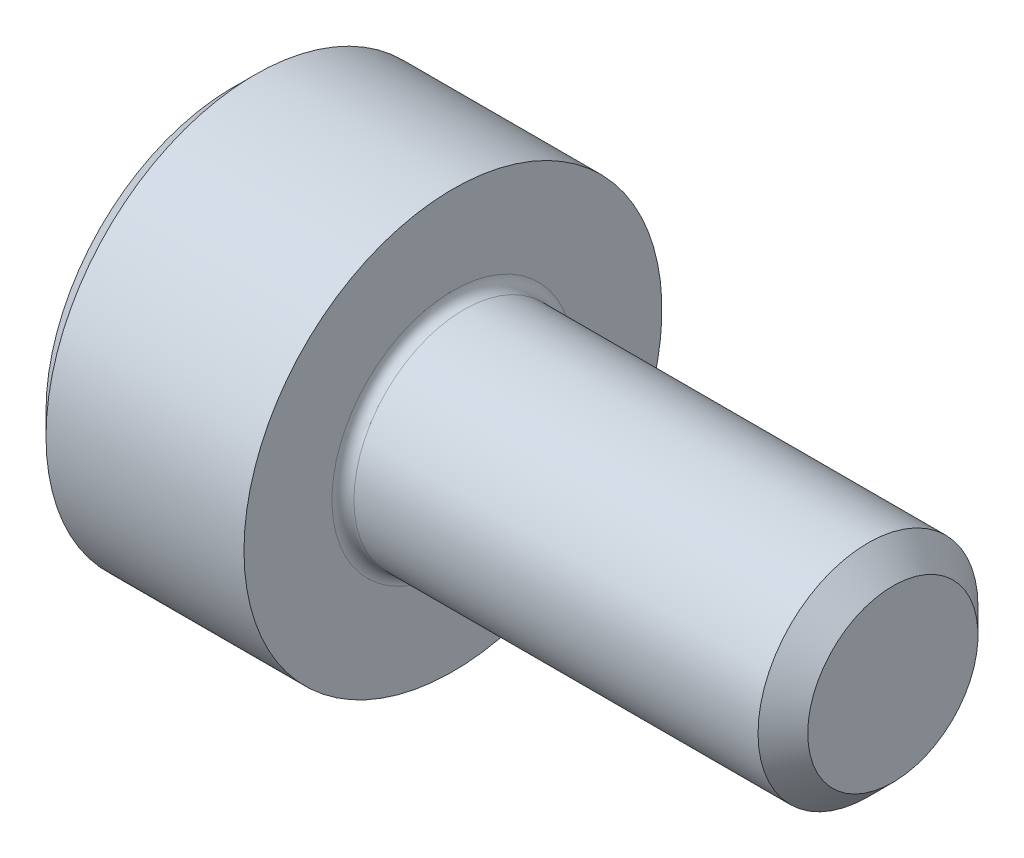
ISO-10303-21;
HEADER;
FILE_DESCRIPTION(('STEP AP214'),'2;1');
FILE_NAME('part.step','',(''),(''),'','','');
FILE_SCHEMA(('AUTOMOTIVE_DESIGN { 1 0 10303 214 1 1 1 1 }'));
ENDSEC;
DATA;
#1=APPLICATION_CONTEXT('core data for automotive mechanical design processes');
#2=APPLICATION_PROTOCOL_DEFINITION('international standard','automotive_design',2000,#1);
#3=PRODUCT_CONTEXT('',#1,'mechanical');
#4=PRODUCT('Part','Part','',(#3));
#5=PRODUCT_RELATED_PRODUCT_CATEGORY('part','',(#4));
#6=PRODUCT_DEFINITION_FORMATION('','',#4);
#7=PRODUCT_DEFINITION_CONTEXT('part definition',#1,'design');
#8=PRODUCT_DEFINITION('design','',#6,#7);
#9=PRODUCT_DEFINITION_SHAPE('','',#8);
#10=(LENGTH_UNIT() NAMED_UNIT(*) SI_UNIT(.MILLI.,.METRE.));
#11=(NAMED_UNIT(*) PLANE_ANGLE_UNIT() SI_UNIT($,.RADIAN.));
#12=(NAMED_UNIT(*) SI_UNIT($,.STERADIAN.) SOLID_ANGLE_UNIT());
#13=UNCERTAINTY_MEASURE_WITH_UNIT(LENGTH_MEASURE(1.E-05),#10,'distance_accuracy_value','');
#14=(GEOMETRIC_REPRESENTATION_CONTEXT(3) GLOBAL_UNCERTAINTY_ASSIGNED_CONTEXT((#13)) GLOBAL_UNIT_ASSIGNED_CONTEXT((#10,
#11,#12)) REPRESENTATION_CONTEXT('',''));
#15=CARTESIAN_POINT('',(0.,0.,0.));
#16=DIRECTION('',(0.,0.,1.));
#17=DIRECTION('',(1.,0.,0.));
#18=AXIS2_PLACEMENT_3D('',#15,#16,#17);
#19=CARTESIAN_POINT('',(0.,0.,0.));
#20=DIRECTION('',(-1.,0.,0.));
#21=DIRECTION('',(0.,0.,1.));
#22=AXIS2_PLACEMENT_3D('',#19,#20,#21);
#23=PLANE('',#22);
#24=DIRECTION('',(0.,-0.499999999999999,0.866025403784439));
#25=VECTOR('',#24,1.);
#26=CARTESIAN_POINT('',(0.,0.892006165897969,0.));
#27=LINE('',#26,#25);
#28=CARTESIAN_POINT('',(0.,0.892006165897969,0.));
#29=VERTEX_POINT('',#28);
#30=CARTESIAN_POINT('',(0.,0.446003082948983,0.772499999999997));
#31=VERTEX_POINT('',#30);
#32=EDGE_CURVE('E390',#29,#31,#27,.T.);
#33=ORIENTED_EDGE('',*,*,#32,.T.);
#34=DIRECTION('',(0.,1.,0.));
#35=VECTOR('',#34,1.);
#36=CARTESIAN_POINT('',(0.,-0.446003082948989,0.772499999999998));
#37=LINE('',#36,#35);
#38=CARTESIAN_POINT('',(0.,-0.446003082948989,0.772499999999998));
#39=VERTEX_POINT('',#38);
#40=EDGE_CURVE('E134',#39,#31,#37,.T.);
#41=ORIENTED_EDGE('',*,*,#40,.F.);
#42=DIRECTION('',(0.,-0.500000000000001,-0.866025403784438));
#43=VECTOR('',#42,1.);
#44=CARTESIAN_POINT('',(0.,-0.446003082948989,0.772499999999998));
#45=LINE('',#44,#43);
#46=CARTESIAN_POINT('',(0.,-0.892006165897975,0.));
#47=VERTEX_POINT('',#46);
#48=EDGE_CURVE('E393',#39,#47,#45,.T.);
#49=ORIENTED_EDGE('',*,*,#48,.T.);
#50=DIRECTION('',(0.,0.499999999999999,-0.866025403784439));
#51=VECTOR('',#50,1.);
#52=CARTESIAN_POINT('',(0.,-0.892006165897975,0.));
#53=LINE('',#52,#51);
#54=CARTESIAN_POINT('',(0.,-0.44600308294899,-0.772500000000001));
#55=VERTEX_POINT('',#54);
#56=EDGE_CURVE('E396',#47,#55,#53,.T.);
#57=ORIENTED_EDGE('',*,*,#56,.T.);
#58=DIRECTION('',(0.,-1.,0.));
#59=VECTOR('',#58,1.);
#60=CARTESIAN_POINT('',(0.,0.446003082948982,-0.772500000000003));
#61=LINE('',#60,#59);
#62=CARTESIAN_POINT('',(0.,0.446003082948982,-0.772500000000003));
#63=VERTEX_POINT('',#62);
#64=EDGE_CURVE('E399',#63,#55,#61,.T.);
#65=ORIENTED_EDGE('',*,*,#64,.F.);
#66=DIRECTION('',(0.,-0.500000000000001,-0.866025403784438));
#67=VECTOR('',#66,1.);
#68=CARTESIAN_POINT('',(0.,0.892006165897969,0.));
#69=LINE('',#68,#67);
#70=EDGE_CURVE('E129',#29,#63,#69,.T.);
#71=ORIENTED_EDGE('',*,*,#70,.F.);
#72=EDGE_LOOP('',(#33,#41,#49,#57,#65,#71));
#73=FACE_BOUND('',#72,.T.);
#74=CARTESIAN_POINT('',(0.,0.,0.));
#75=DIRECTION('',(-1.,0.,0.));
#76=DIRECTION('',(0.,0.,1.));
#77=AXIS2_PLACEMENT_3D('',#74,#75,#76);
#78=CIRCLE('',#77,1.70000000000001);
#79=CARTESIAN_POINT('',(0.,0.,1.70000000000001));
#80=VERTEX_POINT('',#79);
#81=EDGE_CURVE('E145',#80,#80,#78,.T.);
#82=ORIENTED_EDGE('',*,*,#81,.T.);
#83=EDGE_LOOP('',(#82));
#84=FACE_BOUND('',#83,.T.);
#85=ADVANCED_FACE('F38',(#73,#84),#23,.T.);
#86=CARTESIAN_POINT('',(6.,0.774,0.));
#87=DIRECTION('',(1.,0.,0.));
#88=DIRECTION('',(0.,0.,-1.));
#89=AXIS2_PLACEMENT_3D('',#86,#87,#88);
#90=PLANE('',#89);
#91=CARTESIAN_POINT('',(6.,0.,0.));
#92=DIRECTION('',(-1.,0.,0.));
#93=DIRECTION('',(0.,0.,1.));
#94=AXIS2_PLACEMENT_3D('',#91,#92,#93);
#95=CIRCLE('',#94,0.774);
#96=CARTESIAN_POINT('',(6.,0.,0.774));
#97=VERTEX_POINT('',#96);
#98=EDGE_CURVE('E158',#97,#97,#95,.T.);
#99=ORIENTED_EDGE('',*,*,#98,.F.);
#100=EDGE_LOOP('',(#99));
#101=FACE_BOUND('',#100,.T.);
#102=ADVANCED_FACE('F179',(#101),#90,.T.);
#103=CARTESIAN_POINT('',(6.,0.,0.));
#104=DIRECTION('',(-1.,0.,0.));
#105=DIRECTION('',(0.,0.,1.));
#106=AXIS2_PLACEMENT_3D('',#103,#104,#105);
#107=CONICAL_SURFACE('',#106,0.774,0.785398163397411);
#108=CARTESIAN_POINT('',(5.77399999999999,0.,0.));
#109=DIRECTION('',(-1.,0.,0.));
#110=DIRECTION('',(0.,0.,1.));
#111=AXIS2_PLACEMENT_3D('',#108,#109,#110);
#112=CIRCLE('',#111,0.999999999999987);
#113=CARTESIAN_POINT('',(5.77399999999999,0.,0.999999999999987));
#114=VERTEX_POINT('',#113);
#115=EDGE_CURVE('E155',#114,#114,#112,.T.);
#116=ORIENTED_EDGE('',*,*,#115,.F.);
#117=EDGE_LOOP('',(#116));
#118=FACE_BOUND('',#117,.T.);
#119=ORIENTED_EDGE('',*,*,#98,.T.);
#120=EDGE_LOOP('',(#119));
#121=FACE_BOUND('',#120,.T.);
#122=ADVANCED_FACE('F185',(#118,#121),#107,.T.);
#123=CARTESIAN_POINT('',(-31.75,0.,0.));
#124=DIRECTION('',(-1.,0.,0.));
#125=DIRECTION('',(0.,0.,1.));
#126=AXIS2_PLACEMENT_3D('',#123,#124,#125);
#127=CYLINDRICAL_SURFACE('',#126,0.999999999999994);
#128=CARTESIAN_POINT('',(2.1,0.,0.));
#129=DIRECTION('',(1.,0.,0.));
#130=DIRECTION('',(0.,0.,-1.));
#131=AXIS2_PLACEMENT_3D('',#128,#129,#130);
#132=CIRCLE('',#131,0.999999999999994);
#133=CARTESIAN_POINT('',(2.1,0.,-0.999999999999994));
#134=VERTEX_POINT('',#133);
#135=EDGE_CURVE('E11',#134,#134,#132,.T.);
#136=ORIENTED_EDGE('',*,*,#135,.T.);
#137=EDGE_LOOP('',(#136));
#138=FACE_BOUND('',#137,.T.);
#139=ORIENTED_EDGE('',*,*,#115,.T.);
#140=EDGE_LOOP('',(#139));
#141=FACE_BOUND('',#140,.T.);
#142=ADVANCED_FACE('F196',(#138,#141),#127,.T.);
#143=CARTESIAN_POINT('',(2.,1.9,0.));
#144=DIRECTION('',(1.,0.,0.));
#145=DIRECTION('',(0.,0.,-1.));
#146=AXIS2_PLACEMENT_3D('',#143,#144,#145);
#147=PLANE('',#146);
#148=CARTESIAN_POINT('',(2.,0.,0.));
#149=DIRECTION('',(1.,0.,0.));
#150=DIRECTION('',(0.,0.,-1.));
#151=AXIS2_PLACEMENT_3D('',#148,#149,#150);
#152=CIRCLE('',#151,1.09999999999999);
#153=CARTESIAN_POINT('',(2.,0.,-1.09999999999999));
#154=VERTEX_POINT('',#153);
#155=EDGE_CURVE('E46',#154,#154,#152,.F.);
#156=ORIENTED_EDGE('',*,*,#155,.T.);
#157=EDGE_LOOP('',(#156));
#158=FACE_BOUND('',#157,.T.);
#159=CARTESIAN_POINT('',(2.,0.,0.));
#160=DIRECTION('',(-1.,0.,0.));
#161=DIRECTION('',(0.,0.,1.));
#162=AXIS2_PLACEMENT_3D('',#159,#160,#161);
#163=CIRCLE('',#162,1.9);
#164=CARTESIAN_POINT('',(2.,0.,1.9));
#165=VERTEX_POINT('',#164);
#166=EDGE_CURVE('E152',#165,#165,#163,.T.);
#167=ORIENTED_EDGE('',*,*,#166,.F.);
#168=EDGE_LOOP('',(#167));
#169=FACE_BOUND('',#168,.T.);
#170=ADVANCED_FACE('F163',(#158,#169),#147,.T.);
#171=CARTESIAN_POINT('',(-31.75,0.,0.));
#172=DIRECTION('',(-1.,0.,0.));
#173=DIRECTION('',(0.,0.,1.));
#174=AXIS2_PLACEMENT_3D('',#171,#172,#173);
#175=CYLINDRICAL_SURFACE('',#174,1.9);
#176=ORIENTED_EDGE('',*,*,#166,.T.);
#177=EDGE_LOOP('',(#176));
#178=FACE_BOUND('',#177,.T.);
#179=CARTESIAN_POINT('',(0.199999999999999,0.,0.));
#180=DIRECTION('',(-1.,0.,0.));
#181=DIRECTION('',(0.,0.,1.));
#182=AXIS2_PLACEMENT_3D('',#179,#180,#181);
#183=CIRCLE('',#182,1.9);
#184=CARTESIAN_POINT('',(0.199999999999999,0.,1.9));
#185=VERTEX_POINT('',#184);
#186=EDGE_CURVE('E149',#185,#185,#183,.T.);
#187=ORIENTED_EDGE('',*,*,#186,.F.);
#188=EDGE_LOOP('',(#187));
#189=FACE_BOUND('',#188,.T.);
#190=ADVANCED_FACE('F174',(#178,#189),#175,.T.);
#191=CARTESIAN_POINT('',(0.,0.,0.));
#192=DIRECTION('',(1.,0.,0.));
#193=DIRECTION('',(0.,0.,-1.));
#194=AXIS2_PLACEMENT_3D('',#191,#192,#193);
#195=CONICAL_SURFACE('',#194,1.70000000000001,0.785398163397435);
#196=ORIENTED_EDGE('',*,*,#186,.T.);
#197=EDGE_LOOP('',(#196));
#198=FACE_BOUND('',#197,.T.);
#199=ORIENTED_EDGE('',*,*,#81,.F.);
#200=EDGE_LOOP('',(#199));
#201=FACE_BOUND('',#200,.T.);
#202=ADVANCED_FACE('F167',(#198,#201),#195,.T.);
#203=CARTESIAN_POINT('',(2.1,0.,0.));
#204=DIRECTION('',(1.,0.,0.));
#205=DIRECTION('',(0.,0.,-1.));
#206=AXIS2_PLACEMENT_3D('',#203,#204,#205);
#207=TOROIDAL_SURFACE('',#206,1.09999999999999,0.1);
#208=ORIENTED_EDGE('',*,*,#135,.F.);
#209=EDGE_LOOP('',(#208));
#210=FACE_BOUND('',#209,.T.);
#211=ORIENTED_EDGE('',*,*,#155,.F.);
#212=EDGE_LOOP('',(#211));
#213=FACE_BOUND('',#212,.T.);
#214=ADVANCED_FACE('F40',(#210,#213),#207,.F.);
#215=CARTESIAN_POINT('',(1.,0.892006165897969,0.));
#216=DIRECTION('',(0.,-0.866025403784439,-0.499999999999999));
#217=DIRECTION('',(0.,0.499999999999999,-0.866025403784439));
#218=AXIS2_PLACEMENT_3D('',#215,#216,#217);
#219=PLANE('',#218);
#220=ORIENTED_EDGE('',*,*,#32,.F.);
#221=DIRECTION('',(-1.,0.,0.));
#222=VECTOR('',#221,1.);
#223=CARTESIAN_POINT('',(1.,0.892006165897969,0.));
#224=LINE('',#223,#222);
#225=CARTESIAN_POINT('',(1.,0.892006165897969,0.));
#226=VERTEX_POINT('',#225);
#227=EDGE_CURVE('E380',#226,#29,#224,.T.);
#228=ORIENTED_EDGE('',*,*,#227,.F.);
#229=DIRECTION('',(0.,-0.499999999999999,0.866025403784439));
#230=VECTOR('',#229,1.);
#231=CARTESIAN_POINT('',(1.,0.892006165897969,0.));
#232=LINE('',#231,#230);
#233=CARTESIAN_POINT('',(1.,0.669004624423476,0.386249999999998));
#234=VERTEX_POINT('',#233);
#235=EDGE_CURVE('E121',#226,#234,#232,.T.);
#236=ORIENTED_EDGE('',*,*,#235,.T.);
#237=CARTESIAN_POINT('',(1.,0.446003082948983,0.772499999999997));
#238=VERTEX_POINT('',#237);
#239=EDGE_CURVE('E112',#234,#238,#232,.T.);
#240=ORIENTED_EDGE('',*,*,#239,.T.);
#241=DIRECTION('',(-1.,0.,0.));
#242=VECTOR('',#241,1.);
#243=CARTESIAN_POINT('',(1.,0.446003082948983,0.772499999999997));
#244=LINE('',#243,#242);
#245=EDGE_CURVE('E126',#238,#31,#244,.T.);
#246=ORIENTED_EDGE('',*,*,#245,.T.);
#247=EDGE_LOOP('',(#220,#228,#236,#240,#246));
#248=FACE_BOUND('',#247,.T.);
#249=ADVANCED_FACE('F125',(#248),#219,.T.);
#250=CARTESIAN_POINT('',(1.,-0.446003082948989,0.772499999999998));
#251=DIRECTION('',(0.,0.,1.));
#252=DIRECTION('',(0.,-1.,0.));
#253=AXIS2_PLACEMENT_3D('',#250,#251,#252);
#254=PLANE('',#253);
#255=ORIENTED_EDGE('',*,*,#40,.T.);
#256=ORIENTED_EDGE('',*,*,#245,.F.);
#257=DIRECTION('',(0.,1.,0.));
#258=VECTOR('',#257,1.);
#259=CARTESIAN_POINT('',(1.,-0.446003082948989,0.772499999999998));
#260=LINE('',#259,#258);
#261=CARTESIAN_POINT('',(1.,0.,0.772499999999998));
#262=VERTEX_POINT('',#261);
#263=EDGE_CURVE('E109',#262,#238,#260,.T.);
#264=ORIENTED_EDGE('',*,*,#263,.F.);
#265=CARTESIAN_POINT('',(1.,-0.446003082948989,0.772499999999998));
#266=VERTEX_POINT('',#265);
#267=EDGE_CURVE('E120',#266,#262,#260,.T.);
#268=ORIENTED_EDGE('',*,*,#267,.F.);
#269=DIRECTION('',(-1.,0.,0.));
#270=VECTOR('',#269,1.);
#271=CARTESIAN_POINT('',(1.,-0.446003082948989,0.772499999999998));
#272=LINE('',#271,#270);
#273=EDGE_CURVE('E136',#266,#39,#272,.T.);
#274=ORIENTED_EDGE('',*,*,#273,.T.);
#275=EDGE_LOOP('',(#255,#256,#264,#268,#274));
#276=FACE_BOUND('',#275,.T.);
#277=ADVANCED_FACE('F131',(#276),#254,.F.);
#278=CARTESIAN_POINT('',(1.,-0.446003082948989,0.772499999999998));
#279=DIRECTION('',(0.,0.866025403784438,-0.500000000000001));
#280=DIRECTION('',(0.,0.500000000000001,0.866025403784438));
#281=AXIS2_PLACEMENT_3D('',#278,#279,#280);
#282=PLANE('',#281);
#283=ORIENTED_EDGE('',*,*,#48,.F.);
#284=ORIENTED_EDGE('',*,*,#273,.F.);
#285=DIRECTION('',(0.,-0.500000000000001,-0.866025403784438));
#286=VECTOR('',#285,1.);
#287=CARTESIAN_POINT('',(1.,-0.446003082948989,0.772499999999998));
#288=LINE('',#287,#286);
#289=CARTESIAN_POINT('',(1.,-0.66900462442348,0.386250000000002));
#290=VERTEX_POINT('',#289);
#291=EDGE_CURVE('E419',#266,#290,#288,.T.);
#292=ORIENTED_EDGE('',*,*,#291,.T.);
#293=CARTESIAN_POINT('',(1.,-0.892006165897975,0.));
#294=VERTEX_POINT('',#293);
#295=EDGE_CURVE('E408',#290,#294,#288,.T.);
#296=ORIENTED_EDGE('',*,*,#295,.T.);
#297=DIRECTION('',(-1.,0.,0.));
#298=VECTOR('',#297,1.);
#299=CARTESIAN_POINT('',(1.,-0.892006165897975,0.));
#300=LINE('',#299,#298);
#301=EDGE_CURVE('E141',#294,#47,#300,.T.);
#302=ORIENTED_EDGE('',*,*,#301,.T.);
#303=EDGE_LOOP('',(#283,#284,#292,#296,#302));
#304=FACE_BOUND('',#303,.T.);
#305=ADVANCED_FACE('F271',(#304),#282,.T.);
#306=CARTESIAN_POINT('',(1.,-0.892006165897975,0.));
#307=DIRECTION('',(0.,0.866025403784439,0.5));
#308=DIRECTION('',(0.,-0.499999999999999,0.866025403784439));
#309=AXIS2_PLACEMENT_3D('',#306,#307,#308);
#310=PLANE('',#309);
#311=ORIENTED_EDGE('',*,*,#56,.F.);
#312=ORIENTED_EDGE('',*,*,#301,.F.);
#313=DIRECTION('',(0.,0.499999999999999,-0.866025403784439));
#314=VECTOR('',#313,1.);
#315=CARTESIAN_POINT('',(1.,-0.892006165897975,0.));
#316=LINE('',#315,#314);
#317=CARTESIAN_POINT('',(1.,-0.669004624423482,-0.386250000000001));
#318=VERTEX_POINT('',#317);
#319=EDGE_CURVE('E386',#294,#318,#316,.T.);
#320=ORIENTED_EDGE('',*,*,#319,.T.);
#321=CARTESIAN_POINT('',(1.,-0.44600308294899,-0.772500000000001));
#322=VERTEX_POINT('',#321);
#323=EDGE_CURVE('E418',#318,#322,#316,.T.);
#324=ORIENTED_EDGE('',*,*,#323,.T.);
#325=DIRECTION('',(-1.,0.,0.));
#326=VECTOR('',#325,1.);
#327=CARTESIAN_POINT('',(1.,-0.44600308294899,-0.772500000000001));
#328=LINE('',#327,#326);
#329=EDGE_CURVE('E379',#322,#55,#328,.T.);
#330=ORIENTED_EDGE('',*,*,#329,.T.);
#331=EDGE_LOOP('',(#311,#312,#320,#324,#330));
#332=FACE_BOUND('',#331,.T.);
#333=ADVANCED_FACE('F279',(#332),#310,.T.);
#334=CARTESIAN_POINT('',(1.,0.446003082948982,-0.772500000000003));
#335=DIRECTION('',(0.,0.,-1.));
#336=DIRECTION('',(0.,1.,0.));
#337=AXIS2_PLACEMENT_3D('',#334,#335,#336);
#338=PLANE('',#337);
#339=ORIENTED_EDGE('',*,*,#64,.T.);
#340=ORIENTED_EDGE('',*,*,#329,.F.);
#341=DIRECTION('',(0.,-1.,0.));
#342=VECTOR('',#341,1.);
#343=CARTESIAN_POINT('',(1.,0.446003082948982,-0.772500000000003));
#344=LINE('',#343,#342);
#345=CARTESIAN_POINT('',(1.,0.,-0.772500000000002));
#346=VERTEX_POINT('',#345);
#347=EDGE_CURVE('E383',#346,#322,#344,.T.);
#348=ORIENTED_EDGE('',*,*,#347,.F.);
#349=CARTESIAN_POINT('',(1.,0.446003082948982,-0.772500000000003));
#350=VERTEX_POINT('',#349);
#351=EDGE_CURVE('E53',#350,#346,#344,.T.);
#352=ORIENTED_EDGE('',*,*,#351,.F.);
#353=DIRECTION('',(-1.,0.,0.));
#354=VECTOR('',#353,1.);
#355=CARTESIAN_POINT('',(1.,0.446003082948982,-0.772500000000003));
#356=LINE('',#355,#354);
#357=EDGE_CURVE('E376',#350,#63,#356,.T.);
#358=ORIENTED_EDGE('',*,*,#357,.T.);
#359=EDGE_LOOP('',(#339,#340,#348,#352,#358));
#360=FACE_BOUND('',#359,.T.);
#361=ADVANCED_FACE('F288',(#360),#338,.F.);
#362=CARTESIAN_POINT('',(1.,0.892006165897969,0.));
#363=DIRECTION('',(0.,0.866025403784438,-0.500000000000001));
#364=DIRECTION('',(0.,0.500000000000001,0.866025403784438));
#365=AXIS2_PLACEMENT_3D('',#362,#363,#364);
#366=PLANE('',#365);
#367=ORIENTED_EDGE('',*,*,#70,.T.);
#368=ORIENTED_EDGE('',*,*,#357,.F.);
#369=DIRECTION('',(0.,-0.500000000000001,-0.866025403784438));
#370=VECTOR('',#369,1.);
#371=CARTESIAN_POINT('',(1.,0.892006165897969,0.));
#372=LINE('',#371,#370);
#373=CARTESIAN_POINT('',(1.,0.669004624423477,-0.38625));
#374=VERTEX_POINT('',#373);
#375=EDGE_CURVE('E366',#374,#350,#372,.T.);
#376=ORIENTED_EDGE('',*,*,#375,.F.);
#377=EDGE_CURVE('E372',#226,#374,#372,.T.);
#378=ORIENTED_EDGE('',*,*,#377,.F.);
#379=ORIENTED_EDGE('',*,*,#227,.T.);
#380=EDGE_LOOP('',(#367,#368,#376,#378,#379));
#381=FACE_BOUND('',#380,.T.);
#382=ADVANCED_FACE('F297',(#381),#366,.F.);
#383=CARTESIAN_POINT('',(1.,0.,1.545));
#384=DIRECTION('',(1.,0.,0.));
#385=DIRECTION('',(0.,0.,-1.));
#386=AXIS2_PLACEMENT_3D('',#383,#384,#385);
#387=PLANE('',#386);
#388=ORIENTED_EDGE('',*,*,#347,.T.);
#389=ORIENTED_EDGE('',*,*,#323,.F.);
#390=CARTESIAN_POINT('',(1.,0.,0.));
#391=DIRECTION('',(-1.,0.,0.));
#392=DIRECTION('',(0.,0.,1.));
#393=AXIS2_PLACEMENT_3D('',#390,#391,#392);
#394=CIRCLE('',#393,0.772500000000002);
#395=EDGE_CURVE('E414',#346,#318,#394,.T.);
#396=ORIENTED_EDGE('',*,*,#395,.F.);
#397=EDGE_LOOP('',(#388,#389,#396));
#398=FACE_BOUND('',#397,.T.);
#399=ADVANCED_FACE('F306',(#398),#387,.F.);
#400=ORIENTED_EDGE('',*,*,#319,.F.);
#401=ORIENTED_EDGE('',*,*,#295,.F.);
#402=EDGE_CURVE('E139',#318,#290,#394,.T.);
#403=ORIENTED_EDGE('',*,*,#402,.F.);
#404=EDGE_LOOP('',(#400,#401,#403));
#405=FACE_BOUND('',#404,.T.);
#406=ADVANCED_FACE('F315',(#405),#387,.F.);
#407=ORIENTED_EDGE('',*,*,#291,.F.);
#408=ORIENTED_EDGE('',*,*,#267,.T.);
#409=EDGE_CURVE('E135',#290,#262,#394,.T.);
#410=ORIENTED_EDGE('',*,*,#409,.F.);
#411=EDGE_LOOP('',(#407,#408,#410));
#412=FACE_BOUND('',#411,.T.);
#413=ADVANCED_FACE('F324',(#412),#387,.F.);
#414=ORIENTED_EDGE('',*,*,#263,.T.);
#415=ORIENTED_EDGE('',*,*,#239,.F.);
#416=EDGE_CURVE('E115',#262,#234,#394,.T.);
#417=ORIENTED_EDGE('',*,*,#416,.F.);
#418=EDGE_LOOP('',(#414,#415,#417));
#419=FACE_BOUND('',#418,.T.);
#420=ADVANCED_FACE('F111',(#419),#387,.F.);
#421=ORIENTED_EDGE('',*,*,#235,.F.);
#422=ORIENTED_EDGE('',*,*,#377,.T.);
#423=EDGE_CURVE('E146',#234,#374,#394,.T.);
#424=ORIENTED_EDGE('',*,*,#423,.F.);
#425=EDGE_LOOP('',(#421,#422,#424));
#426=FACE_BOUND('',#425,.T.);
#427=ADVANCED_FACE('F339',(#426),#387,.F.);
#428=ORIENTED_EDGE('',*,*,#375,.T.);
#429=ORIENTED_EDGE('',*,*,#351,.T.);
#430=EDGE_CURVE('E369',#374,#346,#394,.T.);
#431=ORIENTED_EDGE('',*,*,#430,.F.);
#432=EDGE_LOOP('',(#428,#429,#431));
#433=FACE_BOUND('',#432,.T.);
#434=ADVANCED_FACE('F254',(#433),#387,.F.);
#435=CARTESIAN_POINT('',(1.,0.,0.));
#436=DIRECTION('',(-1.,0.,0.));
#437=DIRECTION('',(0.,0.,1.));
#438=AXIS2_PLACEMENT_3D('',#435,#436,#437);
#439=CONICAL_SURFACE('',#438,0.772500000000002,1.04719755119659);
#440=CARTESIAN_POINT('',(1.446003082949,0.,0.));
#441=VERTEX_POINT('',#440);
#442=VERTEX_LOOP('',#441);
#443=FACE_BOUND('',#442,.T.);
#444=ORIENTED_EDGE('',*,*,#416,.T.);
#445=ORIENTED_EDGE('',*,*,#423,.T.);
#446=ORIENTED_EDGE('',*,*,#430,.T.);
#447=ORIENTED_EDGE('',*,*,#395,.T.);
#448=ORIENTED_EDGE('',*,*,#402,.T.);
#449=ORIENTED_EDGE('',*,*,#409,.T.);
#450=EDGE_LOOP('',(#444,#445,#446,#447,#448,#449));
#451=FACE_BOUND('',#450,.T.);
#452=ADVANCED_FACE('F189',(#443,#451),#439,.F.);
#453=CLOSED_SHELL('',(#85,#102,#122,#142,#170,#190,#202,#214,#249,#277,#305,#333,#361,#382,#399,
#406,#413,#420,#427,#434,#452));
#454=MANIFOLD_SOLID_BREP('B2',#453);
#455=ADVANCED_BREP_SHAPE_REPRESENTATION('',(#18,#454),#14);
#456=SHAPE_DEFINITION_REPRESENTATION(#9,#455);
ENDSEC;
END-ISO-10303-21;
